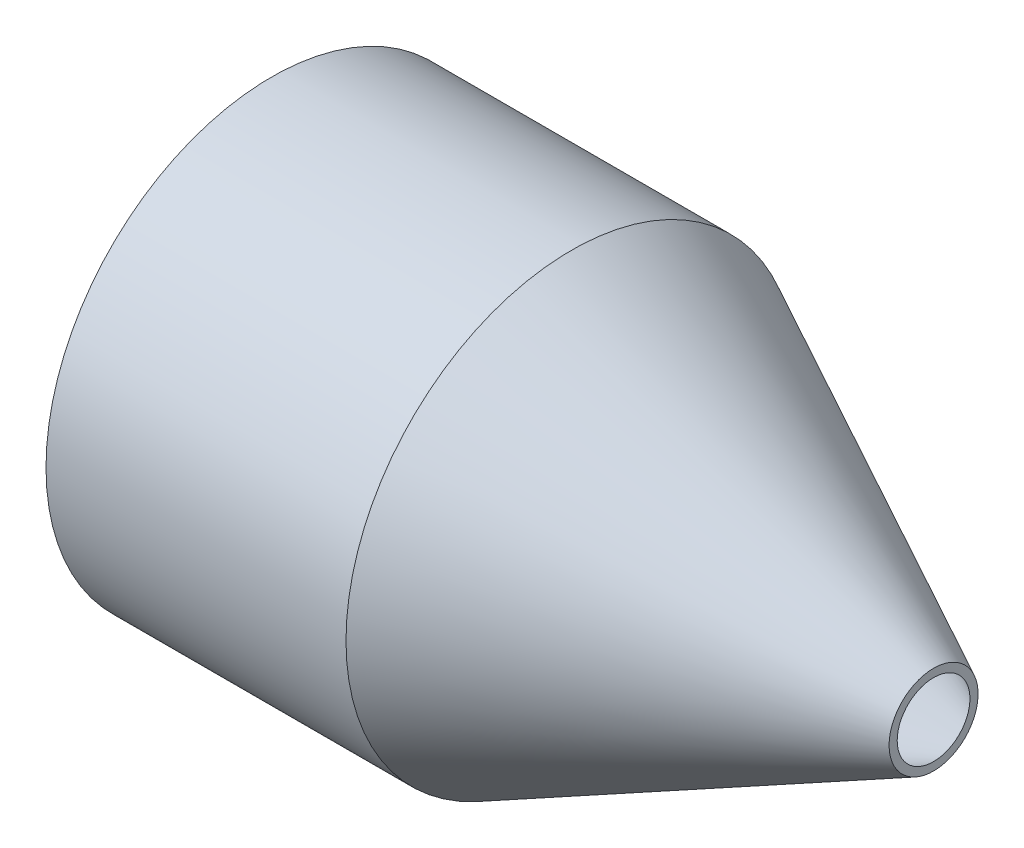
ISO-10303-21;
HEADER;
FILE_DESCRIPTION(('STEP AP214'),'2;1');
FILE_NAME('part.step','',(''),(''),'','','');
FILE_SCHEMA(('AUTOMOTIVE_DESIGN { 1 0 10303 214 1 1 1 1 }'));
ENDSEC;
DATA;
#1=APPLICATION_CONTEXT('core data for automotive mechanical design processes');
#2=APPLICATION_PROTOCOL_DEFINITION('international standard','automotive_design',2000,#1);
#3=PRODUCT_CONTEXT('',#1,'mechanical');
#4=PRODUCT('Part','Part','',(#3));
#5=PRODUCT_RELATED_PRODUCT_CATEGORY('part','',(#4));
#6=PRODUCT_DEFINITION_FORMATION('','',#4);
#7=PRODUCT_DEFINITION_CONTEXT('part definition',#1,'design');
#8=PRODUCT_DEFINITION('design','',#6,#7);
#9=PRODUCT_DEFINITION_SHAPE('','',#8);
#10=(LENGTH_UNIT() NAMED_UNIT(*) SI_UNIT(.MILLI.,.METRE.));
#11=(NAMED_UNIT(*) PLANE_ANGLE_UNIT() SI_UNIT($,.RADIAN.));
#12=(NAMED_UNIT(*) SI_UNIT($,.STERADIAN.) SOLID_ANGLE_UNIT());
#13=UNCERTAINTY_MEASURE_WITH_UNIT(LENGTH_MEASURE(1.E-05),#10,'distance_accuracy_value','');
#14=(GEOMETRIC_REPRESENTATION_CONTEXT(3) GLOBAL_UNCERTAINTY_ASSIGNED_CONTEXT((#13)) GLOBAL_UNIT_ASSIGNED_CONTEXT((#10,
#11,#12)) REPRESENTATION_CONTEXT('',''));
#15=CARTESIAN_POINT('',(0.,0.,0.));
#16=DIRECTION('',(0.,0.,1.));
#17=DIRECTION('',(1.,0.,0.));
#18=AXIS2_PLACEMENT_3D('',#15,#16,#17);
#19=CARTESIAN_POINT('',(16.5574309528718,300.,0.));
#20=DIRECTION('',(1.,0.,0.));
#21=DIRECTION('',(0.,0.,-1.));
#22=AXIS2_PLACEMENT_3D('',#19,#20,#21);
#23=PLANE('',#22);
#24=CARTESIAN_POINT('',(16.5574309528718,0.,0.));
#25=DIRECTION('',(1.,0.,0.));
#26=DIRECTION('',(0.,0.,-1.));
#27=AXIS2_PLACEMENT_3D('',#24,#25,#26);
#28=CIRCLE('',#27,300.);
#29=CARTESIAN_POINT('',(16.5574309528718,0.,-300.));
#30=VERTEX_POINT('',#29);
#31=EDGE_CURVE('E55',#30,#30,#28,.T.);
#32=ORIENTED_EDGE('',*,*,#31,.T.);
#33=EDGE_LOOP('',(#32));
#34=FACE_BOUND('',#33,.T.);
#35=ADVANCED_FACE('F33',(#34),#23,.T.);
#36=CARTESIAN_POINT('',(6.55743095287186,0.,0.));
#37=DIRECTION('',(-1.,0.,0.));
#38=DIRECTION('',(0.,0.,1.));
#39=AXIS2_PLACEMENT_3D('',#36,#37,#38);
#40=PLANE('',#39);
#41=CARTESIAN_POINT('',(6.55743095287186,0.,0.));
#42=DIRECTION('',(1.,0.,0.));
#43=DIRECTION('',(0.,0.,-1.));
#44=AXIS2_PLACEMENT_3D('',#41,#42,#43);
#45=CIRCLE('',#44,310.);
#46=CARTESIAN_POINT('',(6.55743095287186,0.,-310.));
#47=VERTEX_POINT('',#46);
#48=EDGE_CURVE('E10',#47,#47,#45,.T.);
#49=ORIENTED_EDGE('',*,*,#48,.F.);
#50=EDGE_LOOP('',(#49));
#51=FACE_BOUND('',#50,.T.);
#52=ADVANCED_FACE('F72',(#51),#40,.T.);
#53=CARTESIAN_POINT('',(0.,0.,0.));
#54=DIRECTION('',(1.,0.,0.));
#55=DIRECTION('',(0.,0.,-1.));
#56=AXIS2_PLACEMENT_3D('',#53,#54,#55);
#57=CYLINDRICAL_SURFACE('',#56,310.);
#58=ORIENTED_EDGE('',*,*,#48,.T.);
#59=EDGE_LOOP('',(#58));
#60=FACE_BOUND('',#59,.T.);
#61=CARTESIAN_POINT('',(418.91811072787,0.,0.));
#62=DIRECTION('',(1.,0.,0.));
#63=DIRECTION('',(0.,0.,-1.));
#64=AXIS2_PLACEMENT_3D('',#61,#62,#63);
#65=CIRCLE('',#64,310.);
#66=CARTESIAN_POINT('',(418.91811072787,0.,310.));
#67=VERTEX_POINT('',#66);
#68=EDGE_CURVE('E39',#67,#67,#65,.T.);
#69=ORIENTED_EDGE('',*,*,#68,.F.);
#70=EDGE_LOOP('',(#69));
#71=FACE_BOUND('',#70,.T.);
#72=ADVANCED_FACE('F76',(#60,#71),#57,.T.);
#73=CARTESIAN_POINT('',(916.557430952872,0.,0.));
#74=DIRECTION('',(-1.,0.,0.));
#75=DIRECTION('',(0.,0.,1.));
#76=AXIS2_PLACEMENT_3D('',#73,#74,#75);
#77=CONICAL_SURFACE('',#76,61.180339887499,0.463647609000806);
#78=CARTESIAN_POINT('',(916.557430952872,0.,0.));
#79=DIRECTION('',(1.,0.,0.));
#80=DIRECTION('',(0.,0.,-1.));
#81=AXIS2_PLACEMENT_3D('',#78,#79,#80);
#82=CIRCLE('',#81,61.180339887499);
#83=CARTESIAN_POINT('',(916.557430952872,0.,61.180339887499));
#84=VERTEX_POINT('',#83);
#85=EDGE_CURVE('E43',#84,#84,#82,.T.);
#86=CARTESIAN_POINT('',(418.91811072787,0.,310.));
#87=CARTESIAN_POINT('',(424.10185364688,0.,307.408128540495));
#88=CARTESIAN_POINT('',(429.28559656589,0.,304.81625708099));
#89=CARTESIAN_POINT('',(439.653082403911,0.,299.632514161979));
#90=CARTESIAN_POINT('',(444.836825322922,0.,297.040642702474));
#91=CARTESIAN_POINT('',(455.204311160943,0.,291.856899783463));
#92=CARTESIAN_POINT('',(460.388054079953,0.,289.265028323958));
#93=CARTESIAN_POINT('',(470.755539917974,0.,284.081285404948));
#94=CARTESIAN_POINT('',(475.939282836984,0.,281.489413945443));
#95=CARTESIAN_POINT('',(486.306768675005,0.,276.305671026432));
#96=CARTESIAN_POINT('',(491.490511594016,0.,273.713799566927));
#97=CARTESIAN_POINT('',(501.857997432037,0.,268.530056647916));
#98=CARTESIAN_POINT('',(507.041740351047,0.,265.938185188411));
#99=CARTESIAN_POINT('',(517.409226189068,0.,260.754442269401));
#100=CARTESIAN_POINT('',(522.592969108078,0.,258.162570809896));
#101=CARTESIAN_POINT('',(532.960454946099,0.,252.978827890885));
#102=CARTESIAN_POINT('',(538.14419786511,0.,250.38695643138));
#103=CARTESIAN_POINT('',(548.511683703131,0.,245.20321351237));
#104=CARTESIAN_POINT('',(553.695426622141,0.,242.611342052864));
#105=CARTESIAN_POINT('',(564.062912460162,0.,237.427599133854));
#106=CARTESIAN_POINT('',(569.246655379172,0.,234.835727674349));
#107=CARTESIAN_POINT('',(579.614141217193,0.,229.651984755338));
#108=CARTESIAN_POINT('',(584.797884136204,0.,227.060113295833));
#109=CARTESIAN_POINT('',(595.165369974225,0.,221.876370376823));
#110=CARTESIAN_POINT('',(600.349112893235,0.,219.284498917317));
#111=CARTESIAN_POINT('',(610.716598731256,0.,214.100755998307));
#112=CARTESIAN_POINT('',(615.900341650266,0.,211.508884538802));
#113=CARTESIAN_POINT('',(626.267827488287,0.,206.325141619791));
#114=CARTESIAN_POINT('',(631.451570407298,0.,203.733270160286));
#115=CARTESIAN_POINT('',(641.819056245319,0.,198.549527241276));
#116=CARTESIAN_POINT('',(647.002799164329,0.,195.95765578177));
#117=CARTESIAN_POINT('',(657.37028500235,0.,190.77391286276));
#118=CARTESIAN_POINT('',(662.55402792136,0.,188.182041403255));
#119=CARTESIAN_POINT('',(672.921513759381,0.,182.998298484244));
#120=CARTESIAN_POINT('',(678.105256678392,0.,180.406427024739));
#121=CARTESIAN_POINT('',(688.472742516412,0.,175.222684105729));
#122=CARTESIAN_POINT('',(693.656485435423,0.,172.630812646223));
#123=CARTESIAN_POINT('',(704.023971273444,0.,167.447069727213));
#124=CARTESIAN_POINT('',(709.207714192454,0.,164.855198267708));
#125=CARTESIAN_POINT('',(719.575200030475,0.,159.671455348697));
#126=CARTESIAN_POINT('',(724.758942949485,0.,157.079583889192));
#127=CARTESIAN_POINT('',(735.126428787506,0.,151.895840970182));
#128=CARTESIAN_POINT('',(740.310171706517,0.,149.303969510676));
#129=CARTESIAN_POINT('',(750.677657544538,0.,144.120226591666));
#130=CARTESIAN_POINT('',(755.861400463548,0.,141.528355132161));
#131=CARTESIAN_POINT('',(766.228886301569,0.,136.34461221315));
#132=CARTESIAN_POINT('',(771.41262922058,0.,133.752740753645));
#133=CARTESIAN_POINT('',(781.7801150586,0.,128.568997834635));
#134=CARTESIAN_POINT('',(786.963857977611,0.,125.977126375129));
#135=CARTESIAN_POINT('',(797.331343815632,0.,120.793383456119));
#136=CARTESIAN_POINT('',(802.515086734642,0.,118.201511996614));
#137=CARTESIAN_POINT('',(812.882572572663,0.,113.017769077603));
#138=CARTESIAN_POINT('',(818.066315491673,0.,110.425897618098));
#139=CARTESIAN_POINT('',(828.433801329694,0.,105.242154699088));
#140=CARTESIAN_POINT('',(833.617544248705,0.,102.650283239583));
#141=CARTESIAN_POINT('',(843.985030086726,0.,97.4665403205721));
#142=CARTESIAN_POINT('',(849.168773005736,0.,94.8746688610668));
#143=CARTESIAN_POINT('',(859.536258843757,0.,89.6909259420564));
#144=CARTESIAN_POINT('',(864.720001762767,0.,87.0990544825512));
#145=CARTESIAN_POINT('',(875.087487600788,0.,81.9153115635408));
#146=CARTESIAN_POINT('',(880.271230519799,0.,79.3234401040355));
#147=CARTESIAN_POINT('',(890.63871635782,0.,74.1396971850251));
#148=CARTESIAN_POINT('',(895.82245927683,0.,71.5478257255199));
#149=CARTESIAN_POINT('',(906.189945114851,0.,66.3640828065094));
#150=CARTESIAN_POINT('',(911.373688033861,0.,63.7722113470042));
#151=CARTESIAN_POINT('',(916.557430952872,0.,61.180339887499));
#152=B_SPLINE_CURVE_WITH_KNOTS('',3,(#86,#87,#88,#89,#90,#91,#92,#93,#94,#95,#96,#97,#98,#99,
#100,#101,#102,#103,#104,#105,#106,#107,#108,#109,#110,#111,#112,#113,#114,#115,#116,#117,#118,
#119,#120,#121,#122,#123,#124,#125,#126,#127,#128,#129,#130,#131,#132,#133,#134,#135,#136,#137,
#138,#139,#140,#141,#142,#143,#144,#145,#146,#147,#148,#149,#150,#151),.UNSPECIFIED.,.F.,.F.,(4,
2,2,2,2,2,2,2,2,2,2,2,2,2,2,2,2,2,2,2,2,2,2,2,2,2,2,2,2,2,2,2,4),(0.,17.3868023171858,
34.7736046343716,52.1604069515574,69.5472092687432,86.934011585929,104.320813903115,
121.707616220301,139.094418537486,156.481220854672,173.868023171858,191.254825489044,
208.64162780623,226.028430123415,243.415232440601,260.802034757787,278.188837074973,
295.575639392159,312.962441709344,330.34924402653,347.736046343716,365.122848660902,
382.509650978088,399.896453295273,417.283255612459,434.670057929645,452.056860246831,
469.443662564016,486.830464881202,504.217267198388,521.604069515574,538.99087183276,
556.377674149946),.UNSPECIFIED.);
#153=EDGE_CURVE('BSEAM81',#67,#84,#152,.T.);
#154=ORIENTED_EDGE('',*,*,#68,.T.);
#155=ORIENTED_EDGE('',*,*,#85,.F.);
#156=ORIENTED_EDGE('',*,*,#153,.T.);
#157=ORIENTED_EDGE('',*,*,#153,.F.);
#158=EDGE_LOOP('',(#154,#156,#155,#157));
#159=FACE_BOUND('',#158,.T.);
#160=ADVANCED_FACE('F81',(#159),#77,.T.);
#161=CARTESIAN_POINT('',(916.557430952872,50.0000000000001,0.));
#162=DIRECTION('',(1.,0.,0.));
#163=DIRECTION('',(0.,0.,-1.));
#164=AXIS2_PLACEMENT_3D('',#161,#162,#163);
#165=PLANE('',#164);
#166=ORIENTED_EDGE('',*,*,#85,.T.);
#167=EDGE_LOOP('',(#166));
#168=FACE_BOUND('',#167,.T.);
#169=CARTESIAN_POINT('',(916.557430952872,0.,0.));
#170=DIRECTION('',(1.,0.,0.));
#171=DIRECTION('',(0.,0.,-1.));
#172=AXIS2_PLACEMENT_3D('',#169,#170,#171);
#173=CIRCLE('',#172,50.0000000000001);
#174=CARTESIAN_POINT('',(916.557430952872,0.,50.0000000000001));
#175=VERTEX_POINT('',#174);
#176=EDGE_CURVE('E47',#175,#175,#173,.T.);
#177=ORIENTED_EDGE('',*,*,#176,.F.);
#178=EDGE_LOOP('',(#177));
#179=FACE_BOUND('',#178,.T.);
#180=ADVANCED_FACE('F68',(#168,#179),#165,.T.);
#181=CARTESIAN_POINT('',(416.557430952872,0.,0.));
#182=DIRECTION('',(-1.,0.,0.));
#183=DIRECTION('',(0.,0.,1.));
#184=AXIS2_PLACEMENT_3D('',#181,#182,#183);
#185=CONICAL_SURFACE('',#184,300.,0.463647609000806);
#186=CARTESIAN_POINT('',(416.557430952872,0.,0.));
#187=DIRECTION('',(1.,0.,0.));
#188=DIRECTION('',(0.,0.,-1.));
#189=AXIS2_PLACEMENT_3D('',#186,#187,#188);
#190=CIRCLE('',#189,300.);
#191=CARTESIAN_POINT('',(416.557430952872,0.,300.));
#192=VERTEX_POINT('',#191);
#193=EDGE_CURVE('E52',#192,#192,#190,.T.);
#194=CARTESIAN_POINT('',(916.557430952872,0.,50.0000000000001));
#195=CARTESIAN_POINT('',(911.349097619538,0.,52.6041666666668));
#196=CARTESIAN_POINT('',(906.140764286205,0.,55.2083333333334));
#197=CARTESIAN_POINT('',(895.724097619538,0.,60.4166666666668));
#198=CARTESIAN_POINT('',(890.515764286205,0.,63.0208333333334));
#199=CARTESIAN_POINT('',(880.099097619538,0.,68.2291666666668));
#200=CARTESIAN_POINT('',(874.890764286205,0.,70.8333333333334));
#201=CARTESIAN_POINT('',(864.474097619538,0.,76.0416666666668));
#202=CARTESIAN_POINT('',(859.265764286205,0.,78.6458333333334));
#203=CARTESIAN_POINT('',(848.849097619538,0.,83.8541666666668));
#204=CARTESIAN_POINT('',(843.640764286205,0.,86.4583333333334));
#205=CARTESIAN_POINT('',(833.224097619538,0.,91.6666666666667));
#206=CARTESIAN_POINT('',(828.015764286205,0.,94.2708333333334));
#207=CARTESIAN_POINT('',(817.599097619538,0.,99.4791666666667));
#208=CARTESIAN_POINT('',(812.390764286205,0.,102.083333333333));
#209=CARTESIAN_POINT('',(801.974097619538,0.,107.291666666667));
#210=CARTESIAN_POINT('',(796.765764286205,0.,109.895833333333));
#211=CARTESIAN_POINT('',(786.349097619538,0.,115.104166666667));
#212=CARTESIAN_POINT('',(781.140764286205,0.,117.708333333333));
#213=CARTESIAN_POINT('',(770.724097619538,0.,122.916666666667));
#214=CARTESIAN_POINT('',(765.515764286205,0.,125.520833333333));
#215=CARTESIAN_POINT('',(755.099097619538,0.,130.729166666667));
#216=CARTESIAN_POINT('',(749.890764286205,0.,133.333333333333));
#217=CARTESIAN_POINT('',(739.474097619538,0.,138.541666666667));
#218=CARTESIAN_POINT('',(734.265764286205,0.,141.145833333333));
#219=CARTESIAN_POINT('',(723.849097619538,0.,146.354166666667));
#220=CARTESIAN_POINT('',(718.640764286205,0.,148.958333333333));
#221=CARTESIAN_POINT('',(708.224097619538,0.,154.166666666667));
#222=CARTESIAN_POINT('',(703.015764286205,0.,156.770833333333));
#223=CARTESIAN_POINT('',(692.599097619538,0.,161.979166666667));
#224=CARTESIAN_POINT('',(687.390764286205,0.,164.583333333333));
#225=CARTESIAN_POINT('',(676.974097619538,0.,169.791666666667));
#226=CARTESIAN_POINT('',(671.765764286205,0.,172.395833333333));
#227=CARTESIAN_POINT('',(661.349097619538,0.,177.604166666667));
#228=CARTESIAN_POINT('',(656.140764286205,0.,180.208333333333));
#229=CARTESIAN_POINT('',(645.724097619538,0.,185.416666666667));
#230=CARTESIAN_POINT('',(640.515764286205,0.,188.020833333333));
#231=CARTESIAN_POINT('',(630.099097619538,0.,193.229166666667));
#232=CARTESIAN_POINT('',(624.890764286205,0.,195.833333333333));
#233=CARTESIAN_POINT('',(614.474097619538,0.,201.041666666667));
#234=CARTESIAN_POINT('',(609.265764286205,0.,203.645833333333));
#235=CARTESIAN_POINT('',(598.849097619538,0.,208.854166666667));
#236=CARTESIAN_POINT('',(593.640764286205,0.,211.458333333333));
#237=CARTESIAN_POINT('',(583.224097619538,0.,216.666666666667));
#238=CARTESIAN_POINT('',(578.015764286205,0.,219.270833333333));
#239=CARTESIAN_POINT('',(567.599097619538,0.,224.479166666667));
#240=CARTESIAN_POINT('',(562.390764286205,0.,227.083333333333));
#241=CARTESIAN_POINT('',(551.974097619538,0.,232.291666666667));
#242=CARTESIAN_POINT('',(546.765764286205,0.,234.895833333333));
#243=CARTESIAN_POINT('',(536.349097619538,0.,240.104166666667));
#244=CARTESIAN_POINT('',(531.140764286205,0.,242.708333333333));
#245=CARTESIAN_POINT('',(520.724097619538,0.,247.916666666667));
#246=CARTESIAN_POINT('',(515.515764286205,0.,250.520833333333));
#247=CARTESIAN_POINT('',(505.099097619539,0.,255.729166666667));
#248=CARTESIAN_POINT('',(499.890764286205,0.,258.333333333333));
#249=CARTESIAN_POINT('',(489.474097619539,0.,263.541666666667));
#250=CARTESIAN_POINT('',(484.265764286205,0.,266.145833333333));
#251=CARTESIAN_POINT('',(473.849097619539,0.,271.354166666667));
#252=CARTESIAN_POINT('',(468.640764286205,0.,273.958333333333));
#253=CARTESIAN_POINT('',(458.224097619539,0.,279.166666666667));
#254=CARTESIAN_POINT('',(453.015764286205,0.,281.770833333333));
#255=CARTESIAN_POINT('',(442.599097619539,0.,286.979166666667));
#256=CARTESIAN_POINT('',(437.390764286205,0.,289.583333333333));
#257=CARTESIAN_POINT('',(426.974097619539,0.,294.791666666667));
#258=CARTESIAN_POINT('',(421.765764286205,0.,297.395833333333));
#259=CARTESIAN_POINT('',(416.557430952872,0.,300.));
#260=B_SPLINE_CURVE_WITH_KNOTS('',3,(#194,#195,#196,#197,#198,#199,#200,#201,#202,#203,#204,
#205,#206,#207,#208,#209,#210,#211,#212,#213,#214,#215,#216,#217,#218,#219,#220,#221,#222,#223,
#224,#225,#226,#227,#228,#229,#230,#231,#232,#233,#234,#235,#236,#237,#238,#239,#240,#241,#242,
#243,#244,#245,#246,#247,#248,#249,#250,#251,#252,#253,#254,#255,#256,#257,#258,#259),
.UNSPECIFIED.,.F.,.F.,(4,2,2,2,2,2,2,2,2,2,2,2,2,2,2,2,2,2,2,2,2,2,2,2,2,2,2,2,2,2,2,2,4),(0.,
17.4692810742171,34.9385621484342,52.4078432226513,69.8771242968684,87.3464053710855,
104.815686445303,122.28496751952,139.754248593737,157.223529667954,174.692810742171,
192.162091816388,209.631372890605,227.100653964822,244.56993503904,262.039216113257,
279.508497187474,296.977778261691,314.447059335908,331.916340410125,349.385621484342,
366.854902558559,384.324183632776,401.793464706993,419.26274578121,436.732026855427,
454.201307929645,471.670589003862,489.139870078079,506.609151152296,524.078432226513,
541.54771330073,559.016994374947),.UNSPECIFIED.);
#261=EDGE_CURVE('BSEAM62',#175,#192,#260,.T.);
#262=ORIENTED_EDGE('',*,*,#176,.T.);
#263=ORIENTED_EDGE('',*,*,#193,.F.);
#264=ORIENTED_EDGE('',*,*,#261,.T.);
#265=ORIENTED_EDGE('',*,*,#261,.F.);
#266=EDGE_LOOP('',(#262,#264,#263,#265));
#267=FACE_BOUND('',#266,.T.);
#268=ADVANCED_FACE('F62',(#267),#185,.F.);
#269=CARTESIAN_POINT('',(0.,0.,0.));
#270=DIRECTION('',(1.,0.,0.));
#271=DIRECTION('',(0.,0.,-1.));
#272=AXIS2_PLACEMENT_3D('',#269,#270,#271);
#273=CYLINDRICAL_SURFACE('',#272,300.);
#274=ORIENTED_EDGE('',*,*,#193,.T.);
#275=EDGE_LOOP('',(#274));
#276=FACE_BOUND('',#275,.T.);
#277=ORIENTED_EDGE('',*,*,#31,.F.);
#278=EDGE_LOOP('',(#277));
#279=FACE_BOUND('',#278,.T.);
#280=ADVANCED_FACE('F60',(#276,#279),#273,.F.);
#281=CLOSED_SHELL('',(#35,#52,#72,#160,#180,#268,#280));
#282=MANIFOLD_SOLID_BREP('B2',#281);
#283=ADVANCED_BREP_SHAPE_REPRESENTATION('',(#18,#282),#14);
#284=SHAPE_DEFINITION_REPRESENTATION(#9,#283);
ENDSEC;
END-ISO-10303-21;
